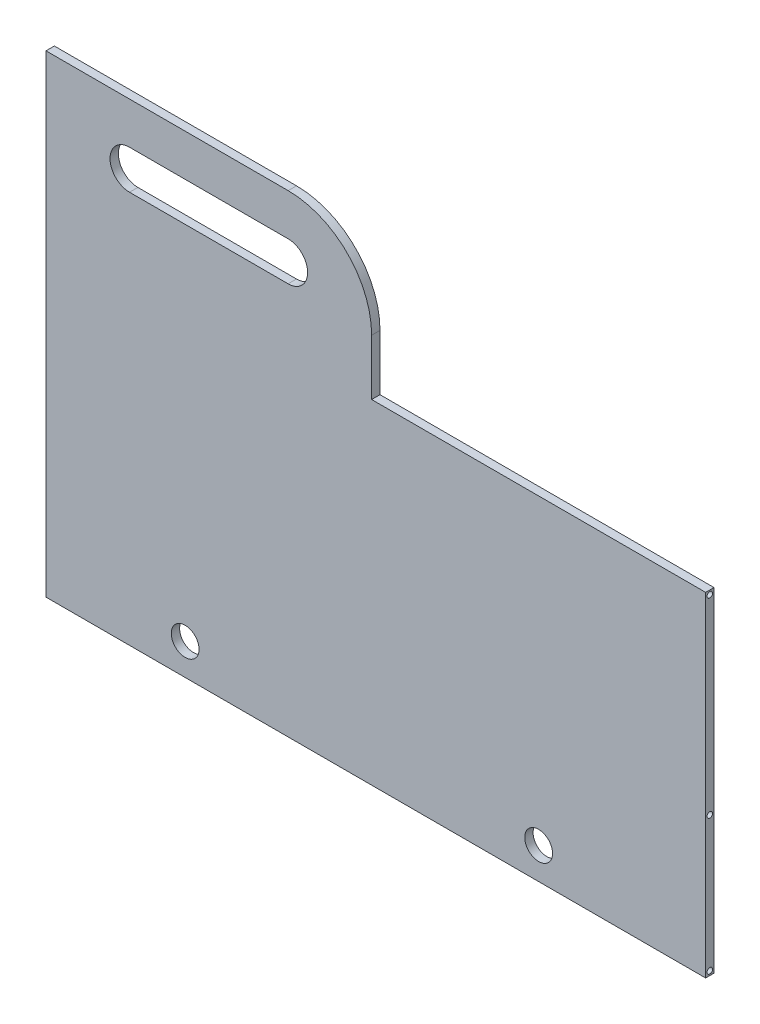
ISO-10303-21;
HEADER;
FILE_DESCRIPTION(('STEP AP214'),'2;1');
FILE_NAME('part.step','',(''),(''),'','','');
FILE_SCHEMA(('AUTOMOTIVE_DESIGN { 1 0 10303 214 1 1 1 1 }'));
ENDSEC;
DATA;
#1=APPLICATION_CONTEXT('core data for automotive mechanical design processes');
#2=APPLICATION_PROTOCOL_DEFINITION('international standard','automotive_design',2000,#1);
#3=PRODUCT_CONTEXT('',#1,'mechanical');
#4=PRODUCT('Part','Part','',(#3));
#5=PRODUCT_RELATED_PRODUCT_CATEGORY('part','',(#4));
#6=PRODUCT_DEFINITION_FORMATION('','',#4);
#7=PRODUCT_DEFINITION_CONTEXT('part definition',#1,'design');
#8=PRODUCT_DEFINITION('design','',#6,#7);
#9=PRODUCT_DEFINITION_SHAPE('','',#8);
#10=(LENGTH_UNIT() NAMED_UNIT(*) SI_UNIT(.MILLI.,.METRE.));
#11=(NAMED_UNIT(*) PLANE_ANGLE_UNIT() SI_UNIT($,.RADIAN.));
#12=(NAMED_UNIT(*) SI_UNIT($,.STERADIAN.) SOLID_ANGLE_UNIT());
#13=UNCERTAINTY_MEASURE_WITH_UNIT(LENGTH_MEASURE(1.E-05),#10,'distance_accuracy_value','');
#14=(GEOMETRIC_REPRESENTATION_CONTEXT(3) GLOBAL_UNCERTAINTY_ASSIGNED_CONTEXT((#13)) GLOBAL_UNIT_ASSIGNED_CONTEXT((#10,
#11,#12)) REPRESENTATION_CONTEXT('',''));
#15=CARTESIAN_POINT('',(0.,0.,0.));
#16=DIRECTION('',(0.,0.,1.));
#17=DIRECTION('',(1.,0.,0.));
#18=AXIS2_PLACEMENT_3D('',#15,#16,#17);
#19=CARTESIAN_POINT('',(87.,140.,3.));
#20=DIRECTION('',(0.,0.,1.));
#21=DIRECTION('',(1.,0.,0.));
#22=AXIS2_PLACEMENT_3D('',#19,#20,#21);
#23=PLANE('',#22);
#24=CARTESIAN_POINT('',(50.,11.25,3.));
#25=DIRECTION('',(0.,0.,1.));
#26=DIRECTION('',(1.,0.,0.));
#27=AXIS2_PLACEMENT_3D('',#24,#25,#26);
#28=CIRCLE('',#27,5.);
#29=CARTESIAN_POINT('',(55.,11.25,3.));
#30=VERTEX_POINT('',#29);
#31=EDGE_CURVE('E151',#30,#30,#28,.T.);
#32=ORIENTED_EDGE('',*,*,#31,.F.);
#33=EDGE_LOOP('',(#32));
#34=FACE_BOUND('',#33,.T.);
#35=DIRECTION('',(0.,-1.,0.));
#36=VECTOR('',#35,1.);
#37=CARTESIAN_POINT('',(0.,0.,3.));
#38=LINE('',#37,#36);
#39=CARTESIAN_POINT('',(0.,170.,3.));
#40=VERTEX_POINT('',#39);
#41=CARTESIAN_POINT('',(0.,0.,3.));
#42=VERTEX_POINT('',#41);
#43=EDGE_CURVE('E161',#40,#42,#38,.T.);
#44=ORIENTED_EDGE('',*,*,#43,.T.);
#45=DIRECTION('',(1.,0.,0.));
#46=VECTOR('',#45,1.);
#47=CARTESIAN_POINT('',(0.,0.,3.));
#48=LINE('',#47,#46);
#49=CARTESIAN_POINT('',(237.,0.,3.));
#50=VERTEX_POINT('',#49);
#51=EDGE_CURVE('E164',#42,#50,#48,.T.);
#52=ORIENTED_EDGE('',*,*,#51,.T.);
#53=DIRECTION('',(0.,1.,0.));
#54=VECTOR('',#53,1.);
#55=CARTESIAN_POINT('',(237.,0.,3.));
#56=LINE('',#55,#54);
#57=CARTESIAN_POINT('',(237.,120.,3.));
#58=VERTEX_POINT('',#57);
#59=EDGE_CURVE('E167',#50,#58,#56,.T.);
#60=ORIENTED_EDGE('',*,*,#59,.T.);
#61=DIRECTION('',(-1.,0.,0.));
#62=VECTOR('',#61,1.);
#63=CARTESIAN_POINT('',(117.,120.,3.));
#64=LINE('',#63,#62);
#65=CARTESIAN_POINT('',(117.,120.,3.));
#66=VERTEX_POINT('',#65);
#67=EDGE_CURVE('E169',#58,#66,#64,.T.);
#68=ORIENTED_EDGE('',*,*,#67,.T.);
#69=DIRECTION('',(0.,1.,0.));
#70=VECTOR('',#69,1.);
#71=CARTESIAN_POINT('',(117.,140.,3.));
#72=LINE('',#71,#70);
#73=CARTESIAN_POINT('',(117.,140.,3.));
#74=VERTEX_POINT('',#73);
#75=EDGE_CURVE('E171',#66,#74,#72,.T.);
#76=ORIENTED_EDGE('',*,*,#75,.T.);
#77=CARTESIAN_POINT('',(87.,140.,3.));
#78=DIRECTION('',(0.,0.,1.));
#79=DIRECTION('',(1.,0.,0.));
#80=AXIS2_PLACEMENT_3D('',#77,#78,#79);
#81=CIRCLE('',#80,30.);
#82=CARTESIAN_POINT('',(87.,170.,3.));
#83=VERTEX_POINT('',#82);
#84=EDGE_CURVE('E173',#74,#83,#81,.T.);
#85=ORIENTED_EDGE('',*,*,#84,.T.);
#86=DIRECTION('',(-1.,0.,0.));
#87=VECTOR('',#86,1.);
#88=CARTESIAN_POINT('',(0.,170.,3.));
#89=LINE('',#88,#87);
#90=EDGE_CURVE('E175',#83,#40,#89,.T.);
#91=ORIENTED_EDGE('',*,*,#90,.T.);
#92=EDGE_LOOP('',(#44,#52,#60,#68,#76,#85,#91));
#93=FACE_BOUND('',#92,.T.);
#94=DIRECTION('',(1.,0.,0.));
#95=VECTOR('',#94,1.);
#96=CARTESIAN_POINT('',(30.,141.,3.));
#97=LINE('',#96,#95);
#98=CARTESIAN_POINT('',(30.,141.,3.));
#99=VERTEX_POINT('',#98);
#100=CARTESIAN_POINT('',(87.,141.,3.));
#101=VERTEX_POINT('',#100);
#102=EDGE_CURVE('E130',#99,#101,#97,.T.);
#103=ORIENTED_EDGE('',*,*,#102,.F.);
#104=CARTESIAN_POINT('',(30.,148.,3.));
#105=DIRECTION('',(0.,0.,1.));
#106=DIRECTION('',(1.,0.,0.));
#107=AXIS2_PLACEMENT_3D('',#104,#105,#106);
#108=CIRCLE('',#107,7.00000000000001);
#109=CARTESIAN_POINT('',(30.,155.,3.));
#110=VERTEX_POINT('',#109);
#111=EDGE_CURVE('E122',#110,#99,#108,.T.);
#112=ORIENTED_EDGE('',*,*,#111,.F.);
#113=DIRECTION('',(-1.,0.,0.));
#114=VECTOR('',#113,1.);
#115=CARTESIAN_POINT('',(30.,155.,3.));
#116=LINE('',#115,#114);
#117=CARTESIAN_POINT('',(87.,155.,3.));
#118=VERTEX_POINT('',#117);
#119=EDGE_CURVE('E145',#118,#110,#116,.T.);
#120=ORIENTED_EDGE('',*,*,#119,.F.);
#121=CARTESIAN_POINT('',(87.,148.,3.));
#122=DIRECTION('',(0.,0.,1.));
#123=DIRECTION('',(1.,0.,0.));
#124=AXIS2_PLACEMENT_3D('',#121,#122,#123);
#125=CIRCLE('',#124,7.00000000000001);
#126=EDGE_CURVE('E143',#101,#118,#125,.T.);
#127=ORIENTED_EDGE('',*,*,#126,.F.);
#128=EDGE_LOOP('',(#103,#112,#120,#127));
#129=FACE_BOUND('',#128,.T.);
#130=CARTESIAN_POINT('',(177.,11.25,3.));
#131=DIRECTION('',(0.,0.,1.));
#132=DIRECTION('',(1.,0.,0.));
#133=AXIS2_PLACEMENT_3D('',#130,#131,#132);
#134=CIRCLE('',#133,4.99999999999999);
#135=CARTESIAN_POINT('',(182.,11.25,3.));
#136=VERTEX_POINT('',#135);
#137=EDGE_CURVE('E365',#136,#136,#134,.T.);
#138=ORIENTED_EDGE('',*,*,#137,.F.);
#139=EDGE_LOOP('',(#138));
#140=FACE_BOUND('',#139,.T.);
#141=ADVANCED_FACE('F39',(#34,#93,#129,#140),#23,.T.);
#142=CARTESIAN_POINT('',(87.,140.,0.));
#143=DIRECTION('',(0.,0.,1.));
#144=DIRECTION('',(1.,0.,0.));
#145=AXIS2_PLACEMENT_3D('',#142,#143,#144);
#146=PLANE('',#145);
#147=DIRECTION('',(0.,-1.,0.));
#148=VECTOR('',#147,1.);
#149=CARTESIAN_POINT('',(0.,0.,0.));
#150=LINE('',#149,#148);
#151=CARTESIAN_POINT('',(0.,170.,0.));
#152=VERTEX_POINT('',#151);
#153=CARTESIAN_POINT('',(0.,0.,0.));
#154=VERTEX_POINT('',#153);
#155=EDGE_CURVE('E138',#152,#154,#150,.T.);
#156=ORIENTED_EDGE('',*,*,#155,.F.);
#157=DIRECTION('',(-1.,0.,0.));
#158=VECTOR('',#157,1.);
#159=CARTESIAN_POINT('',(0.,170.,0.));
#160=LINE('',#159,#158);
#161=CARTESIAN_POINT('',(87.,170.,0.));
#162=VERTEX_POINT('',#161);
#163=EDGE_CURVE('E165',#162,#152,#160,.T.);
#164=ORIENTED_EDGE('',*,*,#163,.F.);
#165=CARTESIAN_POINT('',(87.,140.,0.));
#166=DIRECTION('',(0.,0.,1.));
#167=DIRECTION('',(1.,0.,0.));
#168=AXIS2_PLACEMENT_3D('',#165,#166,#167);
#169=CIRCLE('',#168,30.);
#170=CARTESIAN_POINT('',(117.,140.,0.));
#171=VERTEX_POINT('',#170);
#172=EDGE_CURVE('E188',#171,#162,#169,.T.);
#173=ORIENTED_EDGE('',*,*,#172,.F.);
#174=DIRECTION('',(0.,1.,0.));
#175=VECTOR('',#174,1.);
#176=CARTESIAN_POINT('',(117.,140.,0.));
#177=LINE('',#176,#175);
#178=CARTESIAN_POINT('',(117.,120.,0.));
#179=VERTEX_POINT('',#178);
#180=EDGE_CURVE('E186',#179,#171,#177,.T.);
#181=ORIENTED_EDGE('',*,*,#180,.F.);
#182=DIRECTION('',(-1.,0.,0.));
#183=VECTOR('',#182,1.);
#184=CARTESIAN_POINT('',(117.,120.,0.));
#185=LINE('',#184,#183);
#186=CARTESIAN_POINT('',(237.,120.,0.));
#187=VERTEX_POINT('',#186);
#188=EDGE_CURVE('E184',#187,#179,#185,.T.);
#189=ORIENTED_EDGE('',*,*,#188,.F.);
#190=DIRECTION('',(0.,1.,0.));
#191=VECTOR('',#190,1.);
#192=CARTESIAN_POINT('',(237.,0.,0.));
#193=LINE('',#192,#191);
#194=CARTESIAN_POINT('',(237.,0.,0.));
#195=VERTEX_POINT('',#194);
#196=EDGE_CURVE('E182',#195,#187,#193,.T.);
#197=ORIENTED_EDGE('',*,*,#196,.F.);
#198=DIRECTION('',(1.,0.,0.));
#199=VECTOR('',#198,1.);
#200=CARTESIAN_POINT('',(0.,0.,0.));
#201=LINE('',#200,#199);
#202=EDGE_CURVE('E180',#154,#195,#201,.T.);
#203=ORIENTED_EDGE('',*,*,#202,.F.);
#204=EDGE_LOOP('',(#156,#164,#173,#181,#189,#197,#203));
#205=FACE_BOUND('',#204,.T.);
#206=CARTESIAN_POINT('',(30.,148.,0.));
#207=DIRECTION('',(0.,0.,1.));
#208=DIRECTION('',(1.,0.,0.));
#209=AXIS2_PLACEMENT_3D('',#206,#207,#208);
#210=CIRCLE('',#209,7.00000000000001);
#211=CARTESIAN_POINT('',(30.,155.,0.));
#212=VERTEX_POINT('',#211);
#213=CARTESIAN_POINT('',(30.,141.,0.));
#214=VERTEX_POINT('',#213);
#215=EDGE_CURVE('E62',#212,#214,#210,.T.);
#216=ORIENTED_EDGE('',*,*,#215,.T.);
#217=DIRECTION('',(1.,0.,0.));
#218=VECTOR('',#217,1.);
#219=CARTESIAN_POINT('',(30.,141.,0.));
#220=LINE('',#219,#218);
#221=CARTESIAN_POINT('',(87.,141.,0.));
#222=VERTEX_POINT('',#221);
#223=EDGE_CURVE('E137',#214,#222,#220,.T.);
#224=ORIENTED_EDGE('',*,*,#223,.T.);
#225=CARTESIAN_POINT('',(87.,148.,0.));
#226=DIRECTION('',(0.,0.,1.));
#227=DIRECTION('',(1.,0.,0.));
#228=AXIS2_PLACEMENT_3D('',#225,#226,#227);
#229=CIRCLE('',#228,7.00000000000001);
#230=CARTESIAN_POINT('',(87.,155.,0.));
#231=VERTEX_POINT('',#230);
#232=EDGE_CURVE('E153',#222,#231,#229,.T.);
#233=ORIENTED_EDGE('',*,*,#232,.T.);
#234=DIRECTION('',(-1.,0.,0.));
#235=VECTOR('',#234,1.);
#236=CARTESIAN_POINT('',(30.,155.,0.));
#237=LINE('',#236,#235);
#238=EDGE_CURVE('E131',#231,#212,#237,.T.);
#239=ORIENTED_EDGE('',*,*,#238,.T.);
#240=EDGE_LOOP('',(#216,#224,#233,#239));
#241=FACE_BOUND('',#240,.T.);
#242=CARTESIAN_POINT('',(50.,11.25,0.));
#243=DIRECTION('',(0.,0.,1.));
#244=DIRECTION('',(1.,0.,0.));
#245=AXIS2_PLACEMENT_3D('',#242,#243,#244);
#246=CIRCLE('',#245,5.);
#247=CARTESIAN_POINT('',(55.,11.25,0.));
#248=VERTEX_POINT('',#247);
#249=EDGE_CURVE('E368',#248,#248,#246,.T.);
#250=ORIENTED_EDGE('',*,*,#249,.T.);
#251=EDGE_LOOP('',(#250));
#252=FACE_BOUND('',#251,.T.);
#253=CARTESIAN_POINT('',(177.,11.25,0.));
#254=DIRECTION('',(0.,0.,1.));
#255=DIRECTION('',(1.,0.,0.));
#256=AXIS2_PLACEMENT_3D('',#253,#254,#255);
#257=CIRCLE('',#256,4.99999999999999);
#258=CARTESIAN_POINT('',(182.,11.25,0.));
#259=VERTEX_POINT('',#258);
#260=EDGE_CURVE('E356',#259,#259,#257,.T.);
#261=ORIENTED_EDGE('',*,*,#260,.T.);
#262=EDGE_LOOP('',(#261));
#263=FACE_BOUND('',#262,.T.);
#264=ADVANCED_FACE('F215',(#205,#241,#252,#263),#146,.F.);
#265=CARTESIAN_POINT('',(0.,0.,3.));
#266=DIRECTION('',(1.,0.,0.));
#267=DIRECTION('',(0.,0.,-1.));
#268=AXIS2_PLACEMENT_3D('',#265,#266,#267);
#269=PLANE('',#268);
#270=CARTESIAN_POINT('',(0.,50.,1.5));
#271=DIRECTION('',(-1.,0.,0.));
#272=DIRECTION('',(0.,0.,1.));
#273=AXIS2_PLACEMENT_3D('',#270,#271,#272);
#274=CIRCLE('',#273,1.);
#275=CARTESIAN_POINT('',(0.,50.,2.5));
#276=VERTEX_POINT('',#275);
#277=EDGE_CURVE('E329',#276,#276,#274,.T.);
#278=ORIENTED_EDGE('',*,*,#277,.F.);
#279=EDGE_LOOP('',(#278));
#280=FACE_BOUND('',#279,.T.);
#281=CARTESIAN_POINT('',(0.,168.5,1.5));
#282=DIRECTION('',(-1.,0.,0.));
#283=DIRECTION('',(0.,0.,1.));
#284=AXIS2_PLACEMENT_3D('',#281,#282,#283);
#285=CIRCLE('',#284,1.);
#286=CARTESIAN_POINT('',(0.,168.5,2.5));
#287=VERTEX_POINT('',#286);
#288=EDGE_CURVE('E357',#287,#287,#285,.T.);
#289=ORIENTED_EDGE('',*,*,#288,.F.);
#290=EDGE_LOOP('',(#289));
#291=FACE_BOUND('',#290,.T.);
#292=CARTESIAN_POINT('',(0.,1.5,1.5));
#293=DIRECTION('',(-1.,0.,0.));
#294=DIRECTION('',(0.,0.,1.));
#295=AXIS2_PLACEMENT_3D('',#292,#293,#294);
#296=CIRCLE('',#295,1.);
#297=CARTESIAN_POINT('',(0.,1.5,2.5));
#298=VERTEX_POINT('',#297);
#299=EDGE_CURVE('E360',#298,#298,#296,.T.);
#300=ORIENTED_EDGE('',*,*,#299,.F.);
#301=EDGE_LOOP('',(#300));
#302=FACE_BOUND('',#301,.T.);
#303=ORIENTED_EDGE('',*,*,#155,.T.);
#304=DIRECTION('',(0.,0.,-1.));
#305=VECTOR('',#304,1.);
#306=CARTESIAN_POINT('',(0.,0.,3.));
#307=LINE('',#306,#305);
#308=EDGE_CURVE('E11',#42,#154,#307,.T.);
#309=ORIENTED_EDGE('',*,*,#308,.F.);
#310=ORIENTED_EDGE('',*,*,#43,.F.);
#311=DIRECTION('',(0.,0.,-1.));
#312=VECTOR('',#311,1.);
#313=CARTESIAN_POINT('',(0.,170.,3.));
#314=LINE('',#313,#312);
#315=EDGE_CURVE('E177',#40,#152,#314,.T.);
#316=ORIENTED_EDGE('',*,*,#315,.T.);
#317=EDGE_LOOP('',(#303,#309,#310,#316));
#318=FACE_BOUND('',#317,.T.);
#319=ADVANCED_FACE('F41',(#280,#291,#302,#318),#269,.F.);
#320=CARTESIAN_POINT('',(0.,0.,3.));
#321=DIRECTION('',(0.,1.,0.));
#322=DIRECTION('',(0.,0.,1.));
#323=AXIS2_PLACEMENT_3D('',#320,#321,#322);
#324=PLANE('',#323);
#325=ORIENTED_EDGE('',*,*,#202,.T.);
#326=DIRECTION('',(0.,0.,-1.));
#327=VECTOR('',#326,1.);
#328=CARTESIAN_POINT('',(237.,0.,3.));
#329=LINE('',#328,#327);
#330=EDGE_CURVE('E47',#50,#195,#329,.T.);
#331=ORIENTED_EDGE('',*,*,#330,.F.);
#332=ORIENTED_EDGE('',*,*,#51,.F.);
#333=ORIENTED_EDGE('',*,*,#308,.T.);
#334=EDGE_LOOP('',(#325,#331,#332,#333));
#335=FACE_BOUND('',#334,.T.);
#336=ADVANCED_FACE('F232',(#335),#324,.F.);
#337=CARTESIAN_POINT('',(237.,0.,3.));
#338=DIRECTION('',(-1.,0.,0.));
#339=DIRECTION('',(0.,0.,1.));
#340=AXIS2_PLACEMENT_3D('',#337,#338,#339);
#341=PLANE('',#340);
#342=CARTESIAN_POINT('',(237.,118.5,1.5));
#343=DIRECTION('',(1.,0.,0.));
#344=DIRECTION('',(0.,0.,-1.));
#345=AXIS2_PLACEMENT_3D('',#342,#343,#344);
#346=CIRCLE('',#345,1.);
#347=CARTESIAN_POINT('',(237.,118.5,0.5));
#348=VERTEX_POINT('',#347);
#349=EDGE_CURVE('E330',#348,#348,#346,.T.);
#350=ORIENTED_EDGE('',*,*,#349,.F.);
#351=EDGE_LOOP('',(#350));
#352=FACE_BOUND('',#351,.T.);
#353=CARTESIAN_POINT('',(237.,1.5,1.5));
#354=DIRECTION('',(1.,0.,0.));
#355=DIRECTION('',(0.,0.,-1.));
#356=AXIS2_PLACEMENT_3D('',#353,#354,#355);
#357=CIRCLE('',#356,1.);
#358=CARTESIAN_POINT('',(237.,1.5,0.5));
#359=VERTEX_POINT('',#358);
#360=EDGE_CURVE('E336',#359,#359,#357,.T.);
#361=ORIENTED_EDGE('',*,*,#360,.F.);
#362=EDGE_LOOP('',(#361));
#363=FACE_BOUND('',#362,.T.);
#364=CARTESIAN_POINT('',(237.,50.,1.5));
#365=DIRECTION('',(1.,0.,0.));
#366=DIRECTION('',(0.,0.,-1.));
#367=AXIS2_PLACEMENT_3D('',#364,#365,#366);
#368=CIRCLE('',#367,1.);
#369=CARTESIAN_POINT('',(237.,50.,0.5));
#370=VERTEX_POINT('',#369);
#371=EDGE_CURVE('E344',#370,#370,#368,.T.);
#372=ORIENTED_EDGE('',*,*,#371,.F.);
#373=EDGE_LOOP('',(#372));
#374=FACE_BOUND('',#373,.T.);
#375=ORIENTED_EDGE('',*,*,#196,.T.);
#376=DIRECTION('',(0.,0.,-1.));
#377=VECTOR('',#376,1.);
#378=CARTESIAN_POINT('',(237.,120.,3.));
#379=LINE('',#378,#377);
#380=EDGE_CURVE('E202',#58,#187,#379,.T.);
#381=ORIENTED_EDGE('',*,*,#380,.F.);
#382=ORIENTED_EDGE('',*,*,#59,.F.);
#383=ORIENTED_EDGE('',*,*,#330,.T.);
#384=EDGE_LOOP('',(#375,#381,#382,#383));
#385=FACE_BOUND('',#384,.T.);
#386=ADVANCED_FACE('F209',(#352,#363,#374,#385),#341,.F.);
#387=CARTESIAN_POINT('',(117.,120.,3.));
#388=DIRECTION('',(0.,-1.,0.));
#389=DIRECTION('',(0.,0.,-1.));
#390=AXIS2_PLACEMENT_3D('',#387,#388,#389);
#391=PLANE('',#390);
#392=ORIENTED_EDGE('',*,*,#188,.T.);
#393=DIRECTION('',(0.,0.,-1.));
#394=VECTOR('',#393,1.);
#395=CARTESIAN_POINT('',(117.,120.,3.));
#396=LINE('',#395,#394);
#397=EDGE_CURVE('E199',#66,#179,#396,.T.);
#398=ORIENTED_EDGE('',*,*,#397,.F.);
#399=ORIENTED_EDGE('',*,*,#67,.F.);
#400=ORIENTED_EDGE('',*,*,#380,.T.);
#401=EDGE_LOOP('',(#392,#398,#399,#400));
#402=FACE_BOUND('',#401,.T.);
#403=ADVANCED_FACE('F221',(#402),#391,.F.);
#404=CARTESIAN_POINT('',(117.,140.,3.));
#405=DIRECTION('',(-1.,0.,0.));
#406=DIRECTION('',(0.,0.,1.));
#407=AXIS2_PLACEMENT_3D('',#404,#405,#406);
#408=PLANE('',#407);
#409=ORIENTED_EDGE('',*,*,#180,.T.);
#410=DIRECTION('',(0.,0.,-1.));
#411=VECTOR('',#410,1.);
#412=CARTESIAN_POINT('',(117.,140.,3.));
#413=LINE('',#412,#411);
#414=EDGE_CURVE('E196',#74,#171,#413,.T.);
#415=ORIENTED_EDGE('',*,*,#414,.F.);
#416=ORIENTED_EDGE('',*,*,#75,.F.);
#417=ORIENTED_EDGE('',*,*,#397,.T.);
#418=EDGE_LOOP('',(#409,#415,#416,#417));
#419=FACE_BOUND('',#418,.T.);
#420=ADVANCED_FACE('F225',(#419),#408,.F.);
#421=CARTESIAN_POINT('',(87.,140.,3.));
#422=DIRECTION('',(0.,0.,-1.));
#423=DIRECTION('',(-1.,0.,0.));
#424=AXIS2_PLACEMENT_3D('',#421,#422,#423);
#425=CYLINDRICAL_SURFACE('',#424,30.);
#426=ORIENTED_EDGE('',*,*,#172,.T.);
#427=DIRECTION('',(0.,0.,-1.));
#428=VECTOR('',#427,1.);
#429=CARTESIAN_POINT('',(87.,170.,3.));
#430=LINE('',#429,#428);
#431=EDGE_CURVE('E193',#83,#162,#430,.T.);
#432=ORIENTED_EDGE('',*,*,#431,.F.);
#433=ORIENTED_EDGE('',*,*,#84,.F.);
#434=ORIENTED_EDGE('',*,*,#414,.T.);
#435=EDGE_LOOP('',(#426,#432,#433,#434));
#436=FACE_BOUND('',#435,.T.);
#437=ADVANCED_FACE('F240',(#436),#425,.T.);
#438=CARTESIAN_POINT('',(0.,170.,3.));
#439=DIRECTION('',(0.,-1.,0.));
#440=DIRECTION('',(0.,0.,-1.));
#441=AXIS2_PLACEMENT_3D('',#438,#439,#440);
#442=PLANE('',#441);
#443=ORIENTED_EDGE('',*,*,#163,.T.);
#444=ORIENTED_EDGE('',*,*,#315,.F.);
#445=ORIENTED_EDGE('',*,*,#90,.F.);
#446=ORIENTED_EDGE('',*,*,#431,.T.);
#447=EDGE_LOOP('',(#443,#444,#445,#446));
#448=FACE_BOUND('',#447,.T.);
#449=ADVANCED_FACE('F237',(#448),#442,.F.);
#450=CARTESIAN_POINT('',(30.,148.,3.));
#451=DIRECTION('',(0.,0.,-1.));
#452=DIRECTION('',(-1.,0.,0.));
#453=AXIS2_PLACEMENT_3D('',#450,#451,#452);
#454=CYLINDRICAL_SURFACE('',#453,7.00000000000001);
#455=ORIENTED_EDGE('',*,*,#215,.F.);
#456=DIRECTION('',(0.,0.,-1.));
#457=VECTOR('',#456,1.);
#458=CARTESIAN_POINT('',(30.,155.,3.));
#459=LINE('',#458,#457);
#460=EDGE_CURVE('E126',#110,#212,#459,.T.);
#461=ORIENTED_EDGE('',*,*,#460,.F.);
#462=ORIENTED_EDGE('',*,*,#111,.T.);
#463=DIRECTION('',(0.,0.,-1.));
#464=VECTOR('',#463,1.);
#465=CARTESIAN_POINT('',(30.,141.,3.));
#466=LINE('',#465,#464);
#467=EDGE_CURVE('E125',#99,#214,#466,.T.);
#468=ORIENTED_EDGE('',*,*,#467,.T.);
#469=EDGE_LOOP('',(#455,#461,#462,#468));
#470=FACE_BOUND('',#469,.T.);
#471=ADVANCED_FACE('F124',(#470),#454,.F.);
#472=CARTESIAN_POINT('',(30.,141.,3.));
#473=DIRECTION('',(0.,1.,0.));
#474=DIRECTION('',(0.,0.,1.));
#475=AXIS2_PLACEMENT_3D('',#472,#473,#474);
#476=PLANE('',#475);
#477=ORIENTED_EDGE('',*,*,#223,.F.);
#478=ORIENTED_EDGE('',*,*,#467,.F.);
#479=ORIENTED_EDGE('',*,*,#102,.T.);
#480=DIRECTION('',(0.,0.,-1.));
#481=VECTOR('',#480,1.);
#482=CARTESIAN_POINT('',(87.,141.,3.));
#483=LINE('',#482,#481);
#484=EDGE_CURVE('E139',#101,#222,#483,.T.);
#485=ORIENTED_EDGE('',*,*,#484,.T.);
#486=EDGE_LOOP('',(#477,#478,#479,#485));
#487=FACE_BOUND('',#486,.T.);
#488=ADVANCED_FACE('F134',(#487),#476,.T.);
#489=CARTESIAN_POINT('',(87.,148.,3.));
#490=DIRECTION('',(0.,0.,-1.));
#491=DIRECTION('',(-1.,0.,0.));
#492=AXIS2_PLACEMENT_3D('',#489,#490,#491);
#493=CYLINDRICAL_SURFACE('',#492,7.00000000000001);
#494=ORIENTED_EDGE('',*,*,#232,.F.);
#495=ORIENTED_EDGE('',*,*,#484,.F.);
#496=ORIENTED_EDGE('',*,*,#126,.T.);
#497=DIRECTION('',(0.,0.,-1.));
#498=VECTOR('',#497,1.);
#499=CARTESIAN_POINT('',(87.,155.,3.));
#500=LINE('',#499,#498);
#501=EDGE_CURVE('E54',#118,#231,#500,.T.);
#502=ORIENTED_EDGE('',*,*,#501,.T.);
#503=EDGE_LOOP('',(#494,#495,#496,#502));
#504=FACE_BOUND('',#503,.T.);
#505=ADVANCED_FACE('F262',(#504),#493,.F.);
#506=CARTESIAN_POINT('',(30.,155.,3.));
#507=DIRECTION('',(0.,-1.,0.));
#508=DIRECTION('',(0.,0.,-1.));
#509=AXIS2_PLACEMENT_3D('',#506,#507,#508);
#510=PLANE('',#509);
#511=ORIENTED_EDGE('',*,*,#238,.F.);
#512=ORIENTED_EDGE('',*,*,#501,.F.);
#513=ORIENTED_EDGE('',*,*,#119,.T.);
#514=ORIENTED_EDGE('',*,*,#460,.T.);
#515=EDGE_LOOP('',(#511,#512,#513,#514));
#516=FACE_BOUND('',#515,.T.);
#517=ADVANCED_FACE('F265',(#516),#510,.T.);
#518=CARTESIAN_POINT('',(50.,11.25,3.));
#519=DIRECTION('',(0.,0.,-1.));
#520=DIRECTION('',(-1.,0.,0.));
#521=AXIS2_PLACEMENT_3D('',#518,#519,#520);
#522=CYLINDRICAL_SURFACE('',#521,5.);
#523=ORIENTED_EDGE('',*,*,#31,.T.);
#524=EDGE_LOOP('',(#523));
#525=FACE_BOUND('',#524,.T.);
#526=ORIENTED_EDGE('',*,*,#249,.F.);
#527=EDGE_LOOP('',(#526));
#528=FACE_BOUND('',#527,.T.);
#529=ADVANCED_FACE('F269',(#525,#528),#522,.F.);
#530=CARTESIAN_POINT('',(177.,11.25,3.));
#531=DIRECTION('',(0.,0.,-1.));
#532=DIRECTION('',(-1.,0.,0.));
#533=AXIS2_PLACEMENT_3D('',#530,#531,#532);
#534=CYLINDRICAL_SURFACE('',#533,4.99999999999999);
#535=ORIENTED_EDGE('',*,*,#137,.T.);
#536=EDGE_LOOP('',(#535));
#537=FACE_BOUND('',#536,.T.);
#538=ORIENTED_EDGE('',*,*,#260,.F.);
#539=EDGE_LOOP('',(#538));
#540=FACE_BOUND('',#539,.T.);
#541=ADVANCED_FACE('F272',(#537,#540),#534,.F.);
#542=CARTESIAN_POINT('',(10.,1.5,1.5));
#543=DIRECTION('',(-1.,0.,0.));
#544=DIRECTION('',(0.,0.,1.));
#545=AXIS2_PLACEMENT_3D('',#542,#543,#544);
#546=CYLINDRICAL_SURFACE('',#545,1.);
#547=CARTESIAN_POINT('',(10.,1.5,1.5));
#548=DIRECTION('',(-1.,0.,0.));
#549=DIRECTION('',(0.,0.,1.));
#550=AXIS2_PLACEMENT_3D('',#547,#548,#549);
#551=CIRCLE('',#550,1.);
#552=CARTESIAN_POINT('',(10.,1.5,2.5));
#553=VERTEX_POINT('',#552);
#554=EDGE_CURVE('E351',#553,#553,#551,.T.);
#555=ORIENTED_EDGE('',*,*,#554,.F.);
#556=EDGE_LOOP('',(#555));
#557=FACE_BOUND('',#556,.T.);
#558=ORIENTED_EDGE('',*,*,#299,.T.);
#559=EDGE_LOOP('',(#558));
#560=FACE_BOUND('',#559,.T.);
#561=ADVANCED_FACE('F276',(#557,#560),#546,.F.);
#562=CARTESIAN_POINT('',(10.,1.5,1.5));
#563=DIRECTION('',(-1.,0.,0.));
#564=DIRECTION('',(0.,0.,1.));
#565=AXIS2_PLACEMENT_3D('',#562,#563,#564);
#566=PLANE('',#565);
#567=ORIENTED_EDGE('',*,*,#554,.T.);
#568=EDGE_LOOP('',(#567));
#569=FACE_BOUND('',#568,.T.);
#570=ADVANCED_FACE('F278',(#569),#566,.T.);
#571=CARTESIAN_POINT('',(10.,168.5,1.5));
#572=DIRECTION('',(-1.,0.,0.));
#573=DIRECTION('',(0.,0.,1.));
#574=AXIS2_PLACEMENT_3D('',#571,#572,#573);
#575=CYLINDRICAL_SURFACE('',#574,1.);
#576=CARTESIAN_POINT('',(10.,168.5,1.5));
#577=DIRECTION('',(-1.,0.,0.));
#578=DIRECTION('',(0.,0.,1.));
#579=AXIS2_PLACEMENT_3D('',#576,#577,#578);
#580=CIRCLE('',#579,1.);
#581=CARTESIAN_POINT('',(10.,168.5,2.5));
#582=VERTEX_POINT('',#581);
#583=EDGE_CURVE('E353',#582,#582,#580,.T.);
#584=ORIENTED_EDGE('',*,*,#583,.F.);
#585=EDGE_LOOP('',(#584));
#586=FACE_BOUND('',#585,.T.);
#587=ORIENTED_EDGE('',*,*,#288,.T.);
#588=EDGE_LOOP('',(#587));
#589=FACE_BOUND('',#588,.T.);
#590=ADVANCED_FACE('F281',(#586,#589),#575,.F.);
#591=CARTESIAN_POINT('',(10.,168.5,1.5));
#592=DIRECTION('',(-1.,0.,0.));
#593=DIRECTION('',(0.,0.,1.));
#594=AXIS2_PLACEMENT_3D('',#591,#592,#593);
#595=PLANE('',#594);
#596=ORIENTED_EDGE('',*,*,#583,.T.);
#597=EDGE_LOOP('',(#596));
#598=FACE_BOUND('',#597,.T.);
#599=ADVANCED_FACE('F288',(#598),#595,.T.);
#600=CARTESIAN_POINT('',(10.,50.,1.5));
#601=DIRECTION('',(-1.,0.,0.));
#602=DIRECTION('',(0.,0.,1.));
#603=AXIS2_PLACEMENT_3D('',#600,#601,#602);
#604=CYLINDRICAL_SURFACE('',#603,1.);
#605=CARTESIAN_POINT('',(10.,50.,1.5));
#606=DIRECTION('',(-1.,0.,0.));
#607=DIRECTION('',(0.,0.,1.));
#608=AXIS2_PLACEMENT_3D('',#605,#606,#607);
#609=CIRCLE('',#608,1.);
#610=CARTESIAN_POINT('',(10.,50.,2.5));
#611=VERTEX_POINT('',#610);
#612=EDGE_CURVE('E333',#611,#611,#609,.T.);
#613=ORIENTED_EDGE('',*,*,#612,.F.);
#614=EDGE_LOOP('',(#613));
#615=FACE_BOUND('',#614,.T.);
#616=ORIENTED_EDGE('',*,*,#277,.T.);
#617=EDGE_LOOP('',(#616));
#618=FACE_BOUND('',#617,.T.);
#619=ADVANCED_FACE('F292',(#615,#618),#604,.F.);
#620=CARTESIAN_POINT('',(10.,50.,1.5));
#621=DIRECTION('',(-1.,0.,0.));
#622=DIRECTION('',(0.,0.,1.));
#623=AXIS2_PLACEMENT_3D('',#620,#621,#622);
#624=PLANE('',#623);
#625=ORIENTED_EDGE('',*,*,#612,.T.);
#626=EDGE_LOOP('',(#625));
#627=FACE_BOUND('',#626,.T.);
#628=ADVANCED_FACE('F296',(#627),#624,.T.);
#629=CARTESIAN_POINT('',(227.,50.,1.5));
#630=DIRECTION('',(1.,0.,0.));
#631=DIRECTION('',(0.,0.,-1.));
#632=AXIS2_PLACEMENT_3D('',#629,#630,#631);
#633=CYLINDRICAL_SURFACE('',#632,1.);
#634=CARTESIAN_POINT('',(227.,50.,1.5));
#635=DIRECTION('',(1.,0.,0.));
#636=DIRECTION('',(0.,0.,-1.));
#637=AXIS2_PLACEMENT_3D('',#634,#635,#636);
#638=CIRCLE('',#637,1.);
#639=CARTESIAN_POINT('',(227.,50.,0.5));
#640=VERTEX_POINT('',#639);
#641=EDGE_CURVE('E347',#640,#640,#638,.T.);
#642=ORIENTED_EDGE('',*,*,#641,.F.);
#643=EDGE_LOOP('',(#642));
#644=FACE_BOUND('',#643,.T.);
#645=ORIENTED_EDGE('',*,*,#371,.T.);
#646=EDGE_LOOP('',(#645));
#647=FACE_BOUND('',#646,.T.);
#648=ADVANCED_FACE('F300',(#644,#647),#633,.F.);
#649=CARTESIAN_POINT('',(227.,50.,1.5));
#650=DIRECTION('',(1.,0.,0.));
#651=DIRECTION('',(0.,0.,-1.));
#652=AXIS2_PLACEMENT_3D('',#649,#650,#651);
#653=PLANE('',#652);
#654=ORIENTED_EDGE('',*,*,#641,.T.);
#655=EDGE_LOOP('',(#654));
#656=FACE_BOUND('',#655,.T.);
#657=ADVANCED_FACE('F302',(#656),#653,.T.);
#658=CARTESIAN_POINT('',(227.,1.5,1.5));
#659=DIRECTION('',(1.,0.,0.));
#660=DIRECTION('',(0.,0.,-1.));
#661=AXIS2_PLACEMENT_3D('',#658,#659,#660);
#662=CYLINDRICAL_SURFACE('',#661,1.);
#663=CARTESIAN_POINT('',(227.,1.5,1.5));
#664=DIRECTION('',(1.,0.,0.));
#665=DIRECTION('',(0.,0.,-1.));
#666=AXIS2_PLACEMENT_3D('',#663,#664,#665);
#667=CIRCLE('',#666,1.);
#668=CARTESIAN_POINT('',(227.,1.5,0.5));
#669=VERTEX_POINT('',#668);
#670=EDGE_CURVE('E341',#669,#669,#667,.T.);
#671=ORIENTED_EDGE('',*,*,#670,.F.);
#672=EDGE_LOOP('',(#671));
#673=FACE_BOUND('',#672,.T.);
#674=ORIENTED_EDGE('',*,*,#360,.T.);
#675=EDGE_LOOP('',(#674));
#676=FACE_BOUND('',#675,.T.);
#677=ADVANCED_FACE('F305',(#673,#676),#662,.F.);
#678=CARTESIAN_POINT('',(227.,1.5,1.5));
#679=DIRECTION('',(1.,0.,0.));
#680=DIRECTION('',(0.,0.,-1.));
#681=AXIS2_PLACEMENT_3D('',#678,#679,#680);
#682=PLANE('',#681);
#683=ORIENTED_EDGE('',*,*,#670,.T.);
#684=EDGE_LOOP('',(#683));
#685=FACE_BOUND('',#684,.T.);
#686=ADVANCED_FACE('F310',(#685),#682,.T.);
#687=CARTESIAN_POINT('',(227.,118.5,1.5));
#688=DIRECTION('',(1.,0.,0.));
#689=DIRECTION('',(0.,0.,-1.));
#690=AXIS2_PLACEMENT_3D('',#687,#688,#689);
#691=CYLINDRICAL_SURFACE('',#690,1.);
#692=CARTESIAN_POINT('',(227.,118.5,1.5));
#693=DIRECTION('',(1.,0.,0.));
#694=DIRECTION('',(0.,0.,-1.));
#695=AXIS2_PLACEMENT_3D('',#692,#693,#694);
#696=CIRCLE('',#695,1.);
#697=CARTESIAN_POINT('',(227.,118.5,0.5));
#698=VERTEX_POINT('',#697);
#699=EDGE_CURVE('E328',#698,#698,#696,.T.);
#700=ORIENTED_EDGE('',*,*,#699,.F.);
#701=EDGE_LOOP('',(#700));
#702=FACE_BOUND('',#701,.T.);
#703=ORIENTED_EDGE('',*,*,#349,.T.);
#704=EDGE_LOOP('',(#703));
#705=FACE_BOUND('',#704,.T.);
#706=ADVANCED_FACE('F313',(#702,#705),#691,.F.);
#707=CARTESIAN_POINT('',(227.,118.5,1.5));
#708=DIRECTION('',(1.,0.,0.));
#709=DIRECTION('',(0.,0.,-1.));
#710=AXIS2_PLACEMENT_3D('',#707,#708,#709);
#711=PLANE('',#710);
#712=ORIENTED_EDGE('',*,*,#699,.T.);
#713=EDGE_LOOP('',(#712));
#714=FACE_BOUND('',#713,.T.);
#715=ADVANCED_FACE('F320',(#714),#711,.T.);
#716=CLOSED_SHELL('',(#141,#264,#319,#336,#386,#403,#420,#437,#449,#471,#488,#505,#517,#529,
#541,#561,#570,#590,#599,#619,#628,#648,#657,#677,#686,#706,#715));
#717=MANIFOLD_SOLID_BREP('B2',#716);
#718=ADVANCED_BREP_SHAPE_REPRESENTATION('',(#18,#717),#14);
#719=SHAPE_DEFINITION_REPRESENTATION(#9,#718);
ENDSEC;
END-ISO-10303-21;
